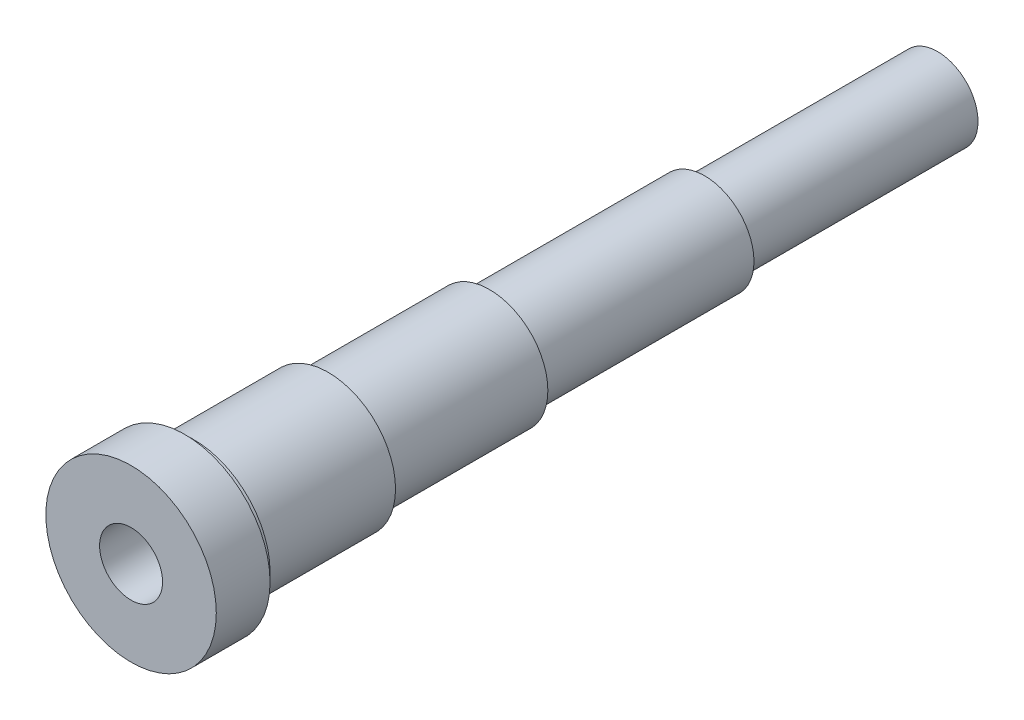
ISO-10303-21;
HEADER;
FILE_DESCRIPTION(('STEP AP214'),'2;1');
FILE_NAME('part.step','',(''),(''),'','','');
FILE_SCHEMA(('AUTOMOTIVE_DESIGN { 1 0 10303 214 1 1 1 1 }'));
ENDSEC;
DATA;
#1=APPLICATION_CONTEXT('core data for automotive mechanical design processes');
#2=APPLICATION_PROTOCOL_DEFINITION('international standard','automotive_design',2000,#1);
#3=PRODUCT_CONTEXT('',#1,'mechanical');
#4=PRODUCT('Part','Part','',(#3));
#5=PRODUCT_RELATED_PRODUCT_CATEGORY('part','',(#4));
#6=PRODUCT_DEFINITION_FORMATION('','',#4);
#7=PRODUCT_DEFINITION_CONTEXT('part definition',#1,'design');
#8=PRODUCT_DEFINITION('design','',#6,#7);
#9=PRODUCT_DEFINITION_SHAPE('','',#8);
#10=(LENGTH_UNIT() NAMED_UNIT(*) SI_UNIT(.MILLI.,.METRE.));
#11=(NAMED_UNIT(*) PLANE_ANGLE_UNIT() SI_UNIT($,.RADIAN.));
#12=(NAMED_UNIT(*) SI_UNIT($,.STERADIAN.) SOLID_ANGLE_UNIT());
#13=UNCERTAINTY_MEASURE_WITH_UNIT(LENGTH_MEASURE(1.E-05),#10,'distance_accuracy_value','');
#14=(GEOMETRIC_REPRESENTATION_CONTEXT(3) GLOBAL_UNCERTAINTY_ASSIGNED_CONTEXT((#13)) GLOBAL_UNIT_ASSIGNED_CONTEXT((#10,
#11,#12)) REPRESENTATION_CONTEXT('',''));
#15=CARTESIAN_POINT('',(0.,0.,0.));
#16=DIRECTION('',(0.,0.,1.));
#17=DIRECTION('',(1.,0.,0.));
#18=AXIS2_PLACEMENT_3D('',#15,#16,#17);
#19=CARTESIAN_POINT('',(0.,-16.31696,254.825393324905));
#20=DIRECTION('',(0.,0.,1.));
#21=DIRECTION('',(1.,0.,0.));
#22=AXIS2_PLACEMENT_3D('',#19,#20,#21);
#23=CYLINDRICAL_SURFACE('',#22,34.40176);
#24=CARTESIAN_POINT('',(0.,-16.31696,238.175017720775));
#25=DIRECTION('',(0.,0.,1.));
#26=DIRECTION('',(1.,0.,0.));
#27=AXIS2_PLACEMENT_3D('',#24,#25,#26);
#28=CIRCLE('',#27,34.40176);
#29=CARTESIAN_POINT('',(34.40176,-16.31696,238.175017720775));
#30=VERTEX_POINT('',#29);
#31=EDGE_CURVE('E75',#30,#30,#28,.T.);
#32=ORIENTED_EDGE('',*,*,#31,.F.);
#33=EDGE_LOOP('',(#32));
#34=FACE_BOUND('',#33,.T.);
#35=CARTESIAN_POINT('',(0.,-16.31696,216.473257720775));
#36=DIRECTION('',(0.,0.,1.));
#37=DIRECTION('',(1.,0.,0.));
#38=AXIS2_PLACEMENT_3D('',#35,#36,#37);
#39=CIRCLE('',#38,34.40176);
#40=CARTESIAN_POINT('',(34.40176,-16.31696,216.473257720775));
#41=VERTEX_POINT('',#40);
#42=EDGE_CURVE('E10',#41,#41,#39,.T.);
#43=ORIENTED_EDGE('',*,*,#42,.T.);
#44=EDGE_LOOP('',(#43));
#45=FACE_BOUND('',#44,.T.);
#46=ADVANCED_FACE('F29',(#34,#45),#23,.T.);
#47=CARTESIAN_POINT('',(0.,18.0848,216.473257720775));
#48=DIRECTION('',(0.,0.,1.));
#49=DIRECTION('',(1.,0.,0.));
#50=AXIS2_PLACEMENT_3D('',#47,#48,#49);
#51=PLANE('',#50);
#52=ORIENTED_EDGE('',*,*,#42,.F.);
#53=EDGE_LOOP('',(#52));
#54=FACE_BOUND('',#53,.T.);
#55=CARTESIAN_POINT('',(0.,-16.31696,216.473257720775));
#56=DIRECTION('',(0.,0.,1.));
#57=DIRECTION('',(1.,0.,0.));
#58=AXIS2_PLACEMENT_3D('',#55,#56,#57);
#59=CIRCLE('',#58,30.7848);
#60=CARTESIAN_POINT('',(30.7848,-16.31696,216.473257720775));
#61=VERTEX_POINT('',#60);
#62=EDGE_CURVE('E35',#61,#61,#59,.T.);
#63=ORIENTED_EDGE('',*,*,#62,.T.);
#64=EDGE_LOOP('',(#63));
#65=FACE_BOUND('',#64,.T.);
#66=ADVANCED_FACE('F82',(#54,#65),#51,.F.);
#67=CARTESIAN_POINT('',(0.,-16.31696,254.825393324905));
#68=DIRECTION('',(0.,0.,1.));
#69=DIRECTION('',(1.,0.,0.));
#70=AXIS2_PLACEMENT_3D('',#67,#68,#69);
#71=CYLINDRICAL_SURFACE('',#70,30.7848);
#72=ORIENTED_EDGE('',*,*,#62,.F.);
#73=EDGE_LOOP('',(#72));
#74=FACE_BOUND('',#73,.T.);
#75=CARTESIAN_POINT('',(0.,-16.31696,212.856297720775));
#76=DIRECTION('',(0.,0.,1.));
#77=DIRECTION('',(1.,0.,0.));
#78=AXIS2_PLACEMENT_3D('',#75,#76,#77);
#79=CIRCLE('',#78,30.7848);
#80=CARTESIAN_POINT('',(30.7848,-16.31696,212.856297720775));
#81=VERTEX_POINT('',#80);
#82=EDGE_CURVE('E39',#81,#81,#79,.T.);
#83=ORIENTED_EDGE('',*,*,#82,.T.);
#84=EDGE_LOOP('',(#83));
#85=FACE_BOUND('',#84,.T.);
#86=ADVANCED_FACE('F86',(#74,#85),#71,.T.);
#87=CARTESIAN_POINT('',(0.,14.46784,212.856297720775));
#88=DIRECTION('',(0.,0.,1.));
#89=DIRECTION('',(1.,0.,0.));
#90=AXIS2_PLACEMENT_3D('',#87,#88,#89);
#91=PLANE('',#90);
#92=ORIENTED_EDGE('',*,*,#82,.F.);
#93=EDGE_LOOP('',(#92));
#94=FACE_BOUND('',#93,.T.);
#95=CARTESIAN_POINT('',(0.,-16.31696,212.856297720775));
#96=DIRECTION('',(0.,0.,1.));
#97=DIRECTION('',(1.,0.,0.));
#98=AXIS2_PLACEMENT_3D('',#95,#96,#97);
#99=CIRCLE('',#98,27.16784);
#100=CARTESIAN_POINT('',(27.16784,-16.31696,212.856297720775));
#101=VERTEX_POINT('',#100);
#102=EDGE_CURVE('E43',#101,#101,#99,.T.);
#103=ORIENTED_EDGE('',*,*,#102,.T.);
#104=EDGE_LOOP('',(#103));
#105=FACE_BOUND('',#104,.T.);
#106=ADVANCED_FACE('F91',(#94,#105),#91,.F.);
#107=CARTESIAN_POINT('',(0.,-16.31696,254.825393324905));
#108=DIRECTION('',(0.,0.,1.));
#109=DIRECTION('',(1.,0.,0.));
#110=AXIS2_PLACEMENT_3D('',#107,#108,#109);
#111=CYLINDRICAL_SURFACE('',#110,27.16784);
#112=ORIENTED_EDGE('',*,*,#102,.F.);
#113=EDGE_LOOP('',(#112));
#114=FACE_BOUND('',#113,.T.);
#115=CARTESIAN_POINT('',(0.,-16.31696,158.601897720775));
#116=DIRECTION('',(0.,0.,1.));
#117=DIRECTION('',(1.,0.,0.));
#118=AXIS2_PLACEMENT_3D('',#115,#116,#117);
#119=CIRCLE('',#118,27.16784);
#120=CARTESIAN_POINT('',(27.16784,-16.31696,158.601897720775));
#121=VERTEX_POINT('',#120);
#122=EDGE_CURVE('E48',#121,#121,#119,.T.);
#123=ORIENTED_EDGE('',*,*,#122,.T.);
#124=EDGE_LOOP('',(#123));
#125=FACE_BOUND('',#124,.T.);
#126=ADVANCED_FACE('F97',(#114,#125),#111,.T.);
#127=CARTESIAN_POINT('',(0.,10.85088,158.601897720775));
#128=DIRECTION('',(0.,0.,1.));
#129=DIRECTION('',(1.,0.,0.));
#130=AXIS2_PLACEMENT_3D('',#127,#128,#129);
#131=PLANE('',#130);
#132=ORIENTED_EDGE('',*,*,#122,.F.);
#133=EDGE_LOOP('',(#132));
#134=FACE_BOUND('',#133,.T.);
#135=CARTESIAN_POINT('',(0.,-16.31696,158.601897720775));
#136=DIRECTION('',(0.,0.,1.));
#137=DIRECTION('',(1.,0.,0.));
#138=AXIS2_PLACEMENT_3D('',#135,#136,#137);
#139=CIRCLE('',#138,23.55088);
#140=CARTESIAN_POINT('',(23.55088,-16.31696,158.601897720775));
#141=VERTEX_POINT('',#140);
#142=EDGE_CURVE('E51',#141,#141,#139,.T.);
#143=ORIENTED_EDGE('',*,*,#142,.T.);
#144=EDGE_LOOP('',(#143));
#145=FACE_BOUND('',#144,.T.);
#146=ADVANCED_FACE('F101',(#134,#145),#131,.F.);
#147=CARTESIAN_POINT('',(0.,-16.31696,254.825393324905));
#148=DIRECTION('',(0.,0.,1.));
#149=DIRECTION('',(1.,0.,0.));
#150=AXIS2_PLACEMENT_3D('',#147,#148,#149);
#151=CYLINDRICAL_SURFACE('',#150,23.55088);
#152=ORIENTED_EDGE('',*,*,#142,.F.);
#153=EDGE_LOOP('',(#152));
#154=FACE_BOUND('',#153,.T.);
#155=CARTESIAN_POINT('',(0.,-16.31696,93.4966177207746));
#156=DIRECTION('',(0.,0.,1.));
#157=DIRECTION('',(1.,0.,0.));
#158=AXIS2_PLACEMENT_3D('',#155,#156,#157);
#159=CIRCLE('',#158,23.55088);
#160=CARTESIAN_POINT('',(23.55088,-16.31696,93.4966177207746));
#161=VERTEX_POINT('',#160);
#162=EDGE_CURVE('E54',#161,#161,#159,.T.);
#163=ORIENTED_EDGE('',*,*,#162,.T.);
#164=EDGE_LOOP('',(#163));
#165=FACE_BOUND('',#164,.T.);
#166=ADVANCED_FACE('F105',(#154,#165),#151,.T.);
#167=CARTESIAN_POINT('',(0.,7.23392,93.4966177207746));
#168=DIRECTION('',(0.,0.,1.));
#169=DIRECTION('',(1.,0.,0.));
#170=AXIS2_PLACEMENT_3D('',#167,#168,#169);
#171=PLANE('',#170);
#172=ORIENTED_EDGE('',*,*,#162,.F.);
#173=EDGE_LOOP('',(#172));
#174=FACE_BOUND('',#173,.T.);
#175=CARTESIAN_POINT('',(0.,-16.31696,93.4966177207746));
#176=DIRECTION('',(0.,0.,1.));
#177=DIRECTION('',(1.,0.,0.));
#178=AXIS2_PLACEMENT_3D('',#175,#176,#177);
#179=CIRCLE('',#178,19.93392);
#180=CARTESIAN_POINT('',(19.93392,-16.31696,93.4966177207746));
#181=VERTEX_POINT('',#180);
#182=EDGE_CURVE('E57',#181,#181,#179,.T.);
#183=ORIENTED_EDGE('',*,*,#182,.T.);
#184=EDGE_LOOP('',(#183));
#185=FACE_BOUND('',#184,.T.);
#186=ADVANCED_FACE('F109',(#174,#185),#171,.F.);
#187=CARTESIAN_POINT('',(0.,-16.31696,254.825393324905));
#188=DIRECTION('',(0.,0.,1.));
#189=DIRECTION('',(1.,0.,0.));
#190=AXIS2_PLACEMENT_3D('',#187,#188,#189);
#191=CYLINDRICAL_SURFACE('',#190,19.93392);
#192=ORIENTED_EDGE('',*,*,#182,.F.);
#193=EDGE_LOOP('',(#192));
#194=FACE_BOUND('',#193,.T.);
#195=CARTESIAN_POINT('',(0.,-16.31696,6.68957772077464));
#196=DIRECTION('',(0.,0.,1.));
#197=DIRECTION('',(1.,0.,0.));
#198=AXIS2_PLACEMENT_3D('',#195,#196,#197);
#199=CIRCLE('',#198,19.93392);
#200=CARTESIAN_POINT('',(19.93392,-16.31696,6.68957772077464));
#201=VERTEX_POINT('',#200);
#202=EDGE_CURVE('E60',#201,#201,#199,.T.);
#203=ORIENTED_EDGE('',*,*,#202,.T.);
#204=EDGE_LOOP('',(#203));
#205=FACE_BOUND('',#204,.T.);
#206=ADVANCED_FACE('F113',(#194,#205),#191,.T.);
#207=CARTESIAN_POINT('',(0.,3.61696,6.68957772077464));
#208=DIRECTION('',(0.,0.,1.));
#209=DIRECTION('',(1.,0.,0.));
#210=AXIS2_PLACEMENT_3D('',#207,#208,#209);
#211=PLANE('',#210);
#212=ORIENTED_EDGE('',*,*,#202,.F.);
#213=EDGE_LOOP('',(#212));
#214=FACE_BOUND('',#213,.T.);
#215=CARTESIAN_POINT('',(0.,-16.31696,6.68957772077464));
#216=DIRECTION('',(0.,0.,1.));
#217=DIRECTION('',(1.,0.,0.));
#218=AXIS2_PLACEMENT_3D('',#215,#216,#217);
#219=CIRCLE('',#218,16.31696);
#220=CARTESIAN_POINT('',(16.31696,-16.31696,6.68957772077464));
#221=VERTEX_POINT('',#220);
#222=EDGE_CURVE('E63',#221,#221,#219,.T.);
#223=ORIENTED_EDGE('',*,*,#222,.T.);
#224=EDGE_LOOP('',(#223));
#225=FACE_BOUND('',#224,.T.);
#226=ADVANCED_FACE('F117',(#214,#225),#211,.F.);
#227=CARTESIAN_POINT('',(0.,-16.31696,254.825393324905));
#228=DIRECTION('',(0.,0.,1.));
#229=DIRECTION('',(1.,0.,0.));
#230=AXIS2_PLACEMENT_3D('',#227,#228,#229);
#231=CYLINDRICAL_SURFACE('',#230,16.31696);
#232=ORIENTED_EDGE('',*,*,#222,.F.);
#233=EDGE_LOOP('',(#232));
#234=FACE_BOUND('',#233,.T.);
#235=CARTESIAN_POINT('',(0.,-16.31696,-87.3513822792254));
#236=DIRECTION('',(0.,0.,1.));
#237=DIRECTION('',(1.,0.,0.));
#238=AXIS2_PLACEMENT_3D('',#235,#236,#237);
#239=CIRCLE('',#238,16.31696);
#240=CARTESIAN_POINT('',(16.31696,-16.31696,-87.3513822792254));
#241=VERTEX_POINT('',#240);
#242=EDGE_CURVE('E66',#241,#241,#239,.T.);
#243=ORIENTED_EDGE('',*,*,#242,.T.);
#244=EDGE_LOOP('',(#243));
#245=FACE_BOUND('',#244,.T.);
#246=ADVANCED_FACE('F121',(#234,#245),#231,.T.);
#247=CARTESIAN_POINT('',(0.,0.,-87.3513822792254));
#248=DIRECTION('',(0.,0.,1.));
#249=DIRECTION('',(1.,0.,0.));
#250=AXIS2_PLACEMENT_3D('',#247,#248,#249);
#251=PLANE('',#250);
#252=ORIENTED_EDGE('',*,*,#242,.F.);
#253=EDGE_LOOP('',(#252));
#254=FACE_BOUND('',#253,.T.);
#255=CARTESIAN_POINT('',(0.,-16.31696,-87.3513822792254));
#256=DIRECTION('',(0.,0.,1.));
#257=DIRECTION('',(1.,0.,0.));
#258=AXIS2_PLACEMENT_3D('',#255,#256,#257);
#259=CIRCLE('',#258,12.7);
#260=CARTESIAN_POINT('',(12.7,-16.31696,-87.3513822792254));
#261=VERTEX_POINT('',#260);
#262=EDGE_CURVE('E69',#261,#261,#259,.T.);
#263=ORIENTED_EDGE('',*,*,#262,.T.);
#264=EDGE_LOOP('',(#263));
#265=FACE_BOUND('',#264,.T.);
#266=ADVANCED_FACE('F125',(#254,#265),#251,.F.);
#267=CARTESIAN_POINT('',(0.,-16.31696,254.825393324905));
#268=DIRECTION('',(0.,0.,1.));
#269=DIRECTION('',(1.,0.,0.));
#270=AXIS2_PLACEMENT_3D('',#267,#268,#269);
#271=CYLINDRICAL_SURFACE('',#270,12.7);
#272=ORIENTED_EDGE('',*,*,#262,.F.);
#273=EDGE_LOOP('',(#272));
#274=FACE_BOUND('',#273,.T.);
#275=CARTESIAN_POINT('',(0.,-16.31696,238.175017720775));
#276=DIRECTION('',(0.,0.,1.));
#277=DIRECTION('',(1.,0.,0.));
#278=AXIS2_PLACEMENT_3D('',#275,#276,#277);
#279=CIRCLE('',#278,12.7);
#280=CARTESIAN_POINT('',(12.7,-16.31696,238.175017720775));
#281=VERTEX_POINT('',#280);
#282=EDGE_CURVE('E72',#281,#281,#279,.T.);
#283=ORIENTED_EDGE('',*,*,#282,.T.);
#284=EDGE_LOOP('',(#283));
#285=FACE_BOUND('',#284,.T.);
#286=ADVANCED_FACE('F129',(#274,#285),#271,.F.);
#287=CARTESIAN_POINT('',(0.,18.0848,238.175017720775));
#288=DIRECTION('',(0.,0.,-1.));
#289=DIRECTION('',(-1.,0.,0.));
#290=AXIS2_PLACEMENT_3D('',#287,#288,#289);
#291=PLANE('',#290);
#292=ORIENTED_EDGE('',*,*,#282,.F.);
#293=EDGE_LOOP('',(#292));
#294=FACE_BOUND('',#293,.T.);
#295=ORIENTED_EDGE('',*,*,#31,.T.);
#296=EDGE_LOOP('',(#295));
#297=FACE_BOUND('',#296,.T.);
#298=ADVANCED_FACE('F79',(#294,#297),#291,.F.);
#299=CLOSED_SHELL('',(#46,#66,#86,#106,#126,#146,#166,#186,#206,#226,#246,#266,#286,#298));
#300=MANIFOLD_SOLID_BREP('B2',#299);
#301=ADVANCED_BREP_SHAPE_REPRESENTATION('',(#18,#300),#14);
#302=SHAPE_DEFINITION_REPRESENTATION(#9,#301);
ENDSEC;
END-ISO-10303-21;
